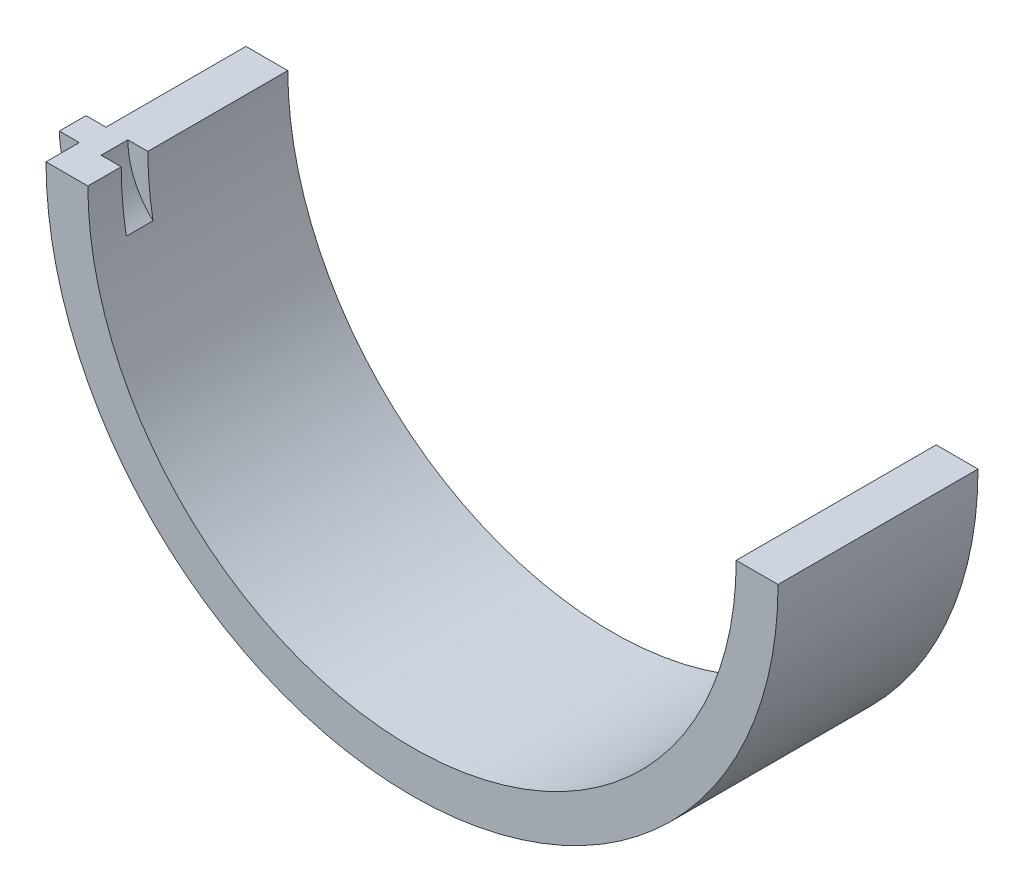
ISO-10303-21;
HEADER;
FILE_DESCRIPTION(('STEP AP214'),'2;1');
FILE_NAME('part.step','',(''),(''),'','','');
FILE_SCHEMA(('AUTOMOTIVE_DESIGN { 1 0 10303 214 1 1 1 1 }'));
ENDSEC;
DATA;
#1=APPLICATION_CONTEXT('core data for automotive mechanical design processes');
#2=APPLICATION_PROTOCOL_DEFINITION('international standard','automotive_design',2000,#1);
#3=PRODUCT_CONTEXT('',#1,'mechanical');
#4=PRODUCT('Part','Part','',(#3));
#5=PRODUCT_RELATED_PRODUCT_CATEGORY('part','',(#4));
#6=PRODUCT_DEFINITION_FORMATION('','',#4);
#7=PRODUCT_DEFINITION_CONTEXT('part definition',#1,'design');
#8=PRODUCT_DEFINITION('design','',#6,#7);
#9=PRODUCT_DEFINITION_SHAPE('','',#8);
#10=(LENGTH_UNIT() NAMED_UNIT(*) SI_UNIT(.MILLI.,.METRE.));
#11=(NAMED_UNIT(*) PLANE_ANGLE_UNIT() SI_UNIT($,.RADIAN.));
#12=(NAMED_UNIT(*) SI_UNIT($,.STERADIAN.) SOLID_ANGLE_UNIT());
#13=UNCERTAINTY_MEASURE_WITH_UNIT(LENGTH_MEASURE(1.E-05),#10,'distance_accuracy_value','');
#14=(GEOMETRIC_REPRESENTATION_CONTEXT(3) GLOBAL_UNCERTAINTY_ASSIGNED_CONTEXT((#13)) GLOBAL_UNIT_ASSIGNED_CONTEXT((#10,
#11,#12)) REPRESENTATION_CONTEXT('',''));
#15=CARTESIAN_POINT('',(0.,0.,0.));
#16=DIRECTION('',(0.,0.,1.));
#17=DIRECTION('',(1.,0.,0.));
#18=AXIS2_PLACEMENT_3D('',#15,#16,#17);
#19=CARTESIAN_POINT('',(-30.8864,34.8742,-19.05));
#20=DIRECTION('',(0.,1.,0.));
#21=DIRECTION('',(-1.,0.,0.));
#22=AXIS2_PLACEMENT_3D('',#19,#20,#21);
#23=PLANE('',#22);
#24=DIRECTION('',(0.,0.,1.));
#25=VECTOR('',#24,1.);
#26=CARTESIAN_POINT('',(-32.7914,34.8742,-5.715));
#27=LINE('',#26,#25);
#28=CARTESIAN_POINT('',(-32.7914,34.8742,-5.715));
#29=VERTEX_POINT('',#28);
#30=CARTESIAN_POINT('',(-32.7914,34.8742,-3.175));
#31=VERTEX_POINT('',#30);
#32=EDGE_CURVE('E130',#29,#31,#27,.T.);
#33=ORIENTED_EDGE('',*,*,#32,.F.);
#34=DIRECTION('',(-1.,0.,0.));
#35=VECTOR('',#34,1.);
#36=CARTESIAN_POINT('',(-30.8864,34.8742,-5.715));
#37=LINE('',#36,#35);
#38=CARTESIAN_POINT('',(-30.8864,34.8742,-5.715));
#39=VERTEX_POINT('',#38);
#40=EDGE_CURVE('E136',#39,#29,#37,.T.);
#41=ORIENTED_EDGE('',*,*,#40,.F.);
#42=DIRECTION('',(0.,0.,1.));
#43=VECTOR('',#42,1.);
#44=CARTESIAN_POINT('',(-30.8864,34.8742,-19.05));
#45=LINE('',#44,#43);
#46=CARTESIAN_POINT('',(-30.8864,34.8742,-19.05));
#47=VERTEX_POINT('',#46);
#48=EDGE_CURVE('E142',#47,#39,#45,.T.);
#49=ORIENTED_EDGE('',*,*,#48,.F.);
#50=DIRECTION('',(-1.,0.,0.));
#51=VECTOR('',#50,1.);
#52=CARTESIAN_POINT('',(-30.8864,34.8742,-19.05));
#53=LINE('',#52,#51);
#54=CARTESIAN_POINT('',(-34.8742,34.8742,-19.05));
#55=VERTEX_POINT('',#54);
#56=EDGE_CURVE('E179',#47,#55,#53,.T.);
#57=ORIENTED_EDGE('',*,*,#56,.T.);
#58=DIRECTION('',(0.,0.,1.));
#59=VECTOR('',#58,1.);
#60=CARTESIAN_POINT('',(-34.8742,34.8742,-19.05));
#61=LINE('',#60,#59);
#62=CARTESIAN_POINT('',(-34.8742,34.8742,-5.715));
#63=VERTEX_POINT('',#62);
#64=EDGE_CURVE('E11',#55,#63,#61,.T.);
#65=ORIENTED_EDGE('',*,*,#64,.T.);
#66=DIRECTION('',(-1.,0.,0.));
#67=VECTOR('',#66,1.);
#68=CARTESIAN_POINT('',(-34.8742,34.8742,-5.715));
#69=LINE('',#68,#67);
#70=CARTESIAN_POINT('',(-36.7792,34.8742,-5.715));
#71=VERTEX_POINT('',#70);
#72=EDGE_CURVE('E154',#63,#71,#69,.T.);
#73=ORIENTED_EDGE('',*,*,#72,.T.);
#74=DIRECTION('',(0.,0.,1.));
#75=VECTOR('',#74,1.);
#76=CARTESIAN_POINT('',(-36.7792,34.8742,-5.715));
#77=LINE('',#76,#75);
#78=CARTESIAN_POINT('',(-36.7792,34.8742,-3.175));
#79=VERTEX_POINT('',#78);
#80=EDGE_CURVE('E161',#71,#79,#77,.T.);
#81=ORIENTED_EDGE('',*,*,#80,.T.);
#82=DIRECTION('',(-1.,0.,0.));
#83=VECTOR('',#82,1.);
#84=CARTESIAN_POINT('',(-34.8742,34.8742,-3.175));
#85=LINE('',#84,#83);
#86=CARTESIAN_POINT('',(-34.8742,34.8742,-3.17500000000001));
#87=VERTEX_POINT('',#86);
#88=EDGE_CURVE('E163',#87,#79,#85,.T.);
#89=ORIENTED_EDGE('',*,*,#88,.F.);
#90=CARTESIAN_POINT('',(-34.8742,34.8742,0.));
#91=VERTEX_POINT('',#90);
#92=EDGE_CURVE('E49',#87,#91,#61,.T.);
#93=ORIENTED_EDGE('',*,*,#92,.T.);
#94=DIRECTION('',(-1.,0.,0.));
#95=VECTOR('',#94,1.);
#96=CARTESIAN_POINT('',(-30.8864,34.8742,0.));
#97=LINE('',#96,#95);
#98=CARTESIAN_POINT('',(-30.8864,34.8742,0.));
#99=VERTEX_POINT('',#98);
#100=EDGE_CURVE('E174',#99,#91,#97,.T.);
#101=ORIENTED_EDGE('',*,*,#100,.F.);
#102=CARTESIAN_POINT('',(-30.8864,34.8742,-3.17500000000001));
#103=VERTEX_POINT('',#102);
#104=EDGE_CURVE('E192',#103,#99,#45,.T.);
#105=ORIENTED_EDGE('',*,*,#104,.F.);
#106=DIRECTION('',(-1.,0.,0.));
#107=VECTOR('',#106,1.);
#108=CARTESIAN_POINT('',(-30.8864,34.8742,-3.175));
#109=LINE('',#108,#107);
#110=EDGE_CURVE('E57',#103,#31,#109,.T.);
#111=ORIENTED_EDGE('',*,*,#110,.T.);
#112=EDGE_LOOP('',(#33,#41,#49,#57,#65,#73,#81,#89,#93,#101,#105,#111));
#113=FACE_BOUND('',#112,.T.);
#114=ADVANCED_FACE('F40',(#113),#23,.T.);
#115=CARTESIAN_POINT('',(0.,34.8742,-19.05));
#116=DIRECTION('',(0.,0.,1.));
#117=DIRECTION('',(1.,0.,0.));
#118=AXIS2_PLACEMENT_3D('',#115,#116,#117);
#119=CYLINDRICAL_SURFACE('',#118,30.8864);
#120=ORIENTED_EDGE('',*,*,#48,.T.);
#121=CARTESIAN_POINT('',(0.,34.8742,-5.715));
#122=DIRECTION('',(0.,0.,1.));
#123=DIRECTION('',(1.,0.,0.));
#124=AXIS2_PLACEMENT_3D('',#121,#122,#123);
#125=CIRCLE('',#124,30.8864);
#126=CARTESIAN_POINT('',(-30.3950680110604,29.3869834412143,-5.715));
#127=VERTEX_POINT('',#126);
#128=EDGE_CURVE('E134',#39,#127,#125,.T.);
#129=ORIENTED_EDGE('',*,*,#128,.T.);
#130=DIRECTION('',(0.,0.,1.));
#131=VECTOR('',#130,1.);
#132=CARTESIAN_POINT('',(-30.3950680110604,29.3869834412143,-5.715));
#133=LINE('',#132,#131);
#134=CARTESIAN_POINT('',(-30.3950680110604,29.3869834412143,-3.175));
#135=VERTEX_POINT('',#134);
#136=EDGE_CURVE('E122',#127,#135,#133,.T.);
#137=ORIENTED_EDGE('',*,*,#136,.T.);
#138=CARTESIAN_POINT('',(0.,34.8742,-3.175));
#139=DIRECTION('',(0.,0.,1.));
#140=DIRECTION('',(1.,0.,0.));
#141=AXIS2_PLACEMENT_3D('',#138,#139,#140);
#142=CIRCLE('',#141,30.8864);
#143=EDGE_CURVE('E147',#103,#135,#142,.T.);
#144=ORIENTED_EDGE('',*,*,#143,.F.);
#145=ORIENTED_EDGE('',*,*,#104,.T.);
#146=CARTESIAN_POINT('',(0.,34.8742,0.));
#147=DIRECTION('',(0.,0.,-1.));
#148=DIRECTION('',(-1.,0.,0.));
#149=AXIS2_PLACEMENT_3D('',#146,#147,#148);
#150=CIRCLE('',#149,30.8864);
#151=CARTESIAN_POINT('',(30.8864,34.8742,0.));
#152=VERTEX_POINT('',#151);
#153=EDGE_CURVE('E187',#152,#99,#150,.T.);
#154=ORIENTED_EDGE('',*,*,#153,.F.);
#155=DIRECTION('',(0.,0.,1.));
#156=VECTOR('',#155,1.);
#157=CARTESIAN_POINT('',(30.8864,34.8742,-19.05));
#158=LINE('',#157,#156);
#159=CARTESIAN_POINT('',(30.8864,34.8742,-19.05));
#160=VERTEX_POINT('',#159);
#161=EDGE_CURVE('E193',#160,#152,#158,.T.);
#162=ORIENTED_EDGE('',*,*,#161,.F.);
#163=CARTESIAN_POINT('',(0.,34.8742,-19.05));
#164=DIRECTION('',(0.,0.,-1.));
#165=DIRECTION('',(-1.,0.,0.));
#166=AXIS2_PLACEMENT_3D('',#163,#164,#165);
#167=CIRCLE('',#166,30.8864);
#168=EDGE_CURVE('E177',#160,#47,#167,.T.);
#169=ORIENTED_EDGE('',*,*,#168,.T.);
#170=EDGE_LOOP('',(#120,#129,#137,#144,#145,#154,#162,#169));
#171=FACE_BOUND('',#170,.T.);
#172=ADVANCED_FACE('F140',(#171),#119,.F.);
#173=CARTESIAN_POINT('',(0.,34.8742,-19.05));
#174=DIRECTION('',(0.,0.,1.));
#175=DIRECTION('',(1.,0.,0.));
#176=AXIS2_PLACEMENT_3D('',#173,#174,#175);
#177=CYLINDRICAL_SURFACE('',#176,34.8742);
#178=DIRECTION('',(0.,0.,1.));
#179=VECTOR('',#178,1.);
#180=CARTESIAN_POINT('',(-34.4398066207838,29.3869834412143,-5.715));
#181=LINE('',#180,#179);
#182=CARTESIAN_POINT('',(-34.4398066207838,29.3869834412143,-5.715));
#183=VERTEX_POINT('',#182);
#184=CARTESIAN_POINT('',(-34.4398066207838,29.3869834412143,-3.175));
#185=VERTEX_POINT('',#184);
#186=EDGE_CURVE('E166',#183,#185,#181,.T.);
#187=ORIENTED_EDGE('',*,*,#186,.F.);
#188=CARTESIAN_POINT('',(0.,34.8742,-5.715));
#189=DIRECTION('',(0.,0.,-1.));
#190=DIRECTION('',(1.,0.,0.));
#191=AXIS2_PLACEMENT_3D('',#188,#189,#190);
#192=CIRCLE('',#191,34.8742);
#193=EDGE_CURVE('E151',#183,#63,#192,.T.);
#194=ORIENTED_EDGE('',*,*,#193,.T.);
#195=ORIENTED_EDGE('',*,*,#64,.F.);
#196=CARTESIAN_POINT('',(0.,34.8742,-19.05));
#197=DIRECTION('',(0.,0.,1.));
#198=DIRECTION('',(1.,0.,0.));
#199=AXIS2_PLACEMENT_3D('',#196,#197,#198);
#200=CIRCLE('',#199,34.8742);
#201=CARTESIAN_POINT('',(34.8742,34.8742,-19.05));
#202=VERTEX_POINT('',#201);
#203=EDGE_CURVE('E170',#55,#202,#200,.T.);
#204=ORIENTED_EDGE('',*,*,#203,.T.);
#205=DIRECTION('',(0.,0.,1.));
#206=VECTOR('',#205,1.);
#207=CARTESIAN_POINT('',(34.8742,34.8742,-19.05));
#208=LINE('',#207,#206);
#209=CARTESIAN_POINT('',(34.8742,34.8742,0.));
#210=VERTEX_POINT('',#209);
#211=EDGE_CURVE('E44',#202,#210,#208,.T.);
#212=ORIENTED_EDGE('',*,*,#211,.T.);
#213=CARTESIAN_POINT('',(0.,34.8742,0.));
#214=DIRECTION('',(0.,0.,1.));
#215=DIRECTION('',(1.,0.,0.));
#216=AXIS2_PLACEMENT_3D('',#213,#214,#215);
#217=CIRCLE('',#216,34.8742);
#218=EDGE_CURVE('E168',#91,#210,#217,.T.);
#219=ORIENTED_EDGE('',*,*,#218,.F.);
#220=ORIENTED_EDGE('',*,*,#92,.F.);
#221=CARTESIAN_POINT('',(0.,34.8742,-3.175));
#222=DIRECTION('',(0.,0.,-1.));
#223=DIRECTION('',(1.,0.,0.));
#224=AXIS2_PLACEMENT_3D('',#221,#222,#223);
#225=CIRCLE('',#224,34.8742);
#226=EDGE_CURVE('E65',#185,#87,#225,.T.);
#227=ORIENTED_EDGE('',*,*,#226,.F.);
#228=EDGE_LOOP('',(#187,#194,#195,#204,#212,#219,#220,#227));
#229=FACE_BOUND('',#228,.T.);
#230=ADVANCED_FACE('F42',(#229),#177,.T.);
#231=CARTESIAN_POINT('',(30.8864,34.8742,-19.05));
#232=DIRECTION('',(0.,1.,0.));
#233=DIRECTION('',(-1.,0.,0.));
#234=AXIS2_PLACEMENT_3D('',#231,#232,#233);
#235=PLANE('',#234);
#236=DIRECTION('',(-1.,0.,0.));
#237=VECTOR('',#236,1.);
#238=CARTESIAN_POINT('',(30.8864,34.8742,0.));
#239=LINE('',#238,#237);
#240=EDGE_CURVE('E184',#210,#152,#239,.T.);
#241=ORIENTED_EDGE('',*,*,#240,.F.);
#242=ORIENTED_EDGE('',*,*,#211,.F.);
#243=DIRECTION('',(-1.,0.,0.));
#244=VECTOR('',#243,1.);
#245=CARTESIAN_POINT('',(30.8864,34.8742,-19.05));
#246=LINE('',#245,#244);
#247=EDGE_CURVE('E173',#202,#160,#246,.T.);
#248=ORIENTED_EDGE('',*,*,#247,.T.);
#249=ORIENTED_EDGE('',*,*,#161,.T.);
#250=EDGE_LOOP('',(#241,#242,#248,#249));
#251=FACE_BOUND('',#250,.T.);
#252=ADVANCED_FACE('F203',(#251),#235,.T.);
#253=CARTESIAN_POINT('',(0.,34.8742,-19.05));
#254=DIRECTION('',(0.,0.,1.));
#255=DIRECTION('',(1.,0.,0.));
#256=AXIS2_PLACEMENT_3D('',#253,#254,#255);
#257=PLANE('',#256);
#258=ORIENTED_EDGE('',*,*,#203,.F.);
#259=ORIENTED_EDGE('',*,*,#56,.F.);
#260=ORIENTED_EDGE('',*,*,#168,.F.);
#261=ORIENTED_EDGE('',*,*,#247,.F.);
#262=EDGE_LOOP('',(#258,#259,#260,#261));
#263=FACE_BOUND('',#262,.T.);
#264=ADVANCED_FACE('F234',(#263),#257,.F.);
#265=CARTESIAN_POINT('',(0.,34.8742,0.));
#266=DIRECTION('',(0.,0.,1.));
#267=DIRECTION('',(1.,0.,0.));
#268=AXIS2_PLACEMENT_3D('',#265,#266,#267);
#269=PLANE('',#268);
#270=ORIENTED_EDGE('',*,*,#218,.T.);
#271=ORIENTED_EDGE('',*,*,#240,.T.);
#272=ORIENTED_EDGE('',*,*,#153,.T.);
#273=ORIENTED_EDGE('',*,*,#100,.T.);
#274=EDGE_LOOP('',(#270,#271,#272,#273));
#275=FACE_BOUND('',#274,.T.);
#276=ADVANCED_FACE('F205',(#275),#269,.T.);
#277=CARTESIAN_POINT('',(-29.174171435361,34.8742,-5.715));
#278=DIRECTION('',(0.,0.,1.));
#279=DIRECTION('',(1.,0.,0.));
#280=AXIS2_PLACEMENT_3D('',#277,#278,#279);
#281=CYLINDRICAL_SURFACE('',#280,7.60502856463901);
#282=CARTESIAN_POINT('',(-29.174171435361,34.8742,-3.175));
#283=DIRECTION('',(0.,0.,1.));
#284=DIRECTION('',(1.,0.,0.));
#285=AXIS2_PLACEMENT_3D('',#282,#283,#284);
#286=CIRCLE('',#285,7.60502856463901);
#287=EDGE_CURVE('E155',#79,#185,#286,.T.);
#288=ORIENTED_EDGE('',*,*,#287,.F.);
#289=ORIENTED_EDGE('',*,*,#80,.F.);
#290=CARTESIAN_POINT('',(-29.174171435361,34.8742,-5.715));
#291=DIRECTION('',(0.,0.,1.));
#292=DIRECTION('',(1.,0.,0.));
#293=AXIS2_PLACEMENT_3D('',#290,#291,#292);
#294=CIRCLE('',#293,7.60502856463901);
#295=EDGE_CURVE('E158',#71,#183,#294,.T.);
#296=ORIENTED_EDGE('',*,*,#295,.T.);
#297=ORIENTED_EDGE('',*,*,#186,.T.);
#298=EDGE_LOOP('',(#288,#289,#296,#297));
#299=FACE_BOUND('',#298,.T.);
#300=ADVANCED_FACE('F211',(#299),#281,.T.);
#301=CARTESIAN_POINT('',(0.,34.8742,-5.715));
#302=DIRECTION('',(0.,0.,1.));
#303=DIRECTION('',(1.,0.,0.));
#304=AXIS2_PLACEMENT_3D('',#301,#302,#303);
#305=PLANE('',#304);
#306=ORIENTED_EDGE('',*,*,#193,.F.);
#307=ORIENTED_EDGE('',*,*,#295,.F.);
#308=ORIENTED_EDGE('',*,*,#72,.F.);
#309=EDGE_LOOP('',(#306,#307,#308));
#310=FACE_BOUND('',#309,.T.);
#311=ADVANCED_FACE('F215',(#310),#305,.F.);
#312=CARTESIAN_POINT('',(0.,34.8742,-3.175));
#313=DIRECTION('',(0.,0.,1.));
#314=DIRECTION('',(1.,0.,0.));
#315=AXIS2_PLACEMENT_3D('',#312,#313,#314);
#316=PLANE('',#315);
#317=ORIENTED_EDGE('',*,*,#226,.T.);
#318=ORIENTED_EDGE('',*,*,#88,.T.);
#319=ORIENTED_EDGE('',*,*,#287,.T.);
#320=EDGE_LOOP('',(#317,#318,#319));
#321=FACE_BOUND('',#320,.T.);
#322=ADVANCED_FACE('F213',(#321),#316,.T.);
#323=CARTESIAN_POINT('',(-25.3108103467917,34.8742,-5.715));
#324=DIRECTION('',(0.,0.,1.));
#325=DIRECTION('',(1.,0.,0.));
#326=AXIS2_PLACEMENT_3D('',#323,#324,#325);
#327=CYLINDRICAL_SURFACE('',#326,7.48058965320831);
#328=CARTESIAN_POINT('',(-25.3108103467917,34.8742,-3.175));
#329=DIRECTION('',(0.,0.,1.));
#330=DIRECTION('',(1.,0.,0.));
#331=AXIS2_PLACEMENT_3D('',#328,#329,#330);
#332=CIRCLE('',#331,7.48058965320831);
#333=EDGE_CURVE('E127',#31,#135,#332,.T.);
#334=ORIENTED_EDGE('',*,*,#333,.T.);
#335=ORIENTED_EDGE('',*,*,#136,.F.);
#336=CARTESIAN_POINT('',(-25.3108103467917,34.8742,-5.715));
#337=DIRECTION('',(0.,0.,1.));
#338=DIRECTION('',(1.,0.,0.));
#339=AXIS2_PLACEMENT_3D('',#336,#337,#338);
#340=CIRCLE('',#339,7.48058965320831);
#341=EDGE_CURVE('E125',#29,#127,#340,.T.);
#342=ORIENTED_EDGE('',*,*,#341,.F.);
#343=ORIENTED_EDGE('',*,*,#32,.T.);
#344=EDGE_LOOP('',(#334,#335,#342,#343));
#345=FACE_BOUND('',#344,.T.);
#346=ADVANCED_FACE('F124',(#345),#327,.F.);
#347=CARTESIAN_POINT('',(0.,34.8742,-5.715));
#348=DIRECTION('',(0.,0.,1.));
#349=DIRECTION('',(1.,0.,0.));
#350=AXIS2_PLACEMENT_3D('',#347,#348,#349);
#351=PLANE('',#350);
#352=ORIENTED_EDGE('',*,*,#128,.F.);
#353=ORIENTED_EDGE('',*,*,#40,.T.);
#354=ORIENTED_EDGE('',*,*,#341,.T.);
#355=EDGE_LOOP('',(#352,#353,#354));
#356=FACE_BOUND('',#355,.T.);
#357=ADVANCED_FACE('F133',(#356),#351,.T.);
#358=CARTESIAN_POINT('',(0.,34.8742,-3.175));
#359=DIRECTION('',(0.,0.,1.));
#360=DIRECTION('',(1.,0.,0.));
#361=AXIS2_PLACEMENT_3D('',#358,#359,#360);
#362=PLANE('',#361);
#363=ORIENTED_EDGE('',*,*,#143,.T.);
#364=ORIENTED_EDGE('',*,*,#333,.F.);
#365=ORIENTED_EDGE('',*,*,#110,.F.);
#366=EDGE_LOOP('',(#363,#364,#365));
#367=FACE_BOUND('',#366,.T.);
#368=ADVANCED_FACE('F269',(#367),#362,.F.);
#369=CLOSED_SHELL('',(#114,#172,#230,#252,#264,#276,#300,#311,#322,#346,#357,#368));
#370=MANIFOLD_SOLID_BREP('B2',#369);
#371=ADVANCED_BREP_SHAPE_REPRESENTATION('',(#18,#370),#14);
#372=SHAPE_DEFINITION_REPRESENTATION(#9,#371);
ENDSEC;
END-ISO-10303-21;
